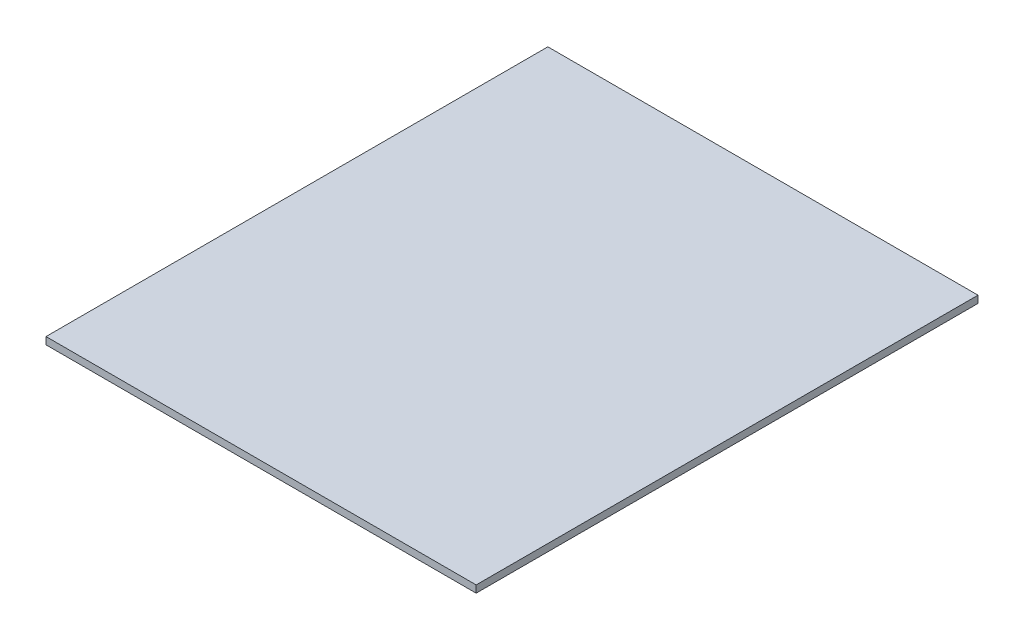
ISO-10303-21;
HEADER;
FILE_DESCRIPTION(('STEP AP214'),'2;1');
FILE_NAME('part.step','',(''),(''),'','','');
FILE_SCHEMA(('AUTOMOTIVE_DESIGN { 1 0 10303 214 1 1 1 1 }'));
ENDSEC;
DATA;
#1=APPLICATION_CONTEXT('core data for automotive mechanical design processes');
#2=APPLICATION_PROTOCOL_DEFINITION('international standard','automotive_design',2000,#1);
#3=PRODUCT_CONTEXT('',#1,'mechanical');
#4=PRODUCT('Part','Part','',(#3));
#5=PRODUCT_RELATED_PRODUCT_CATEGORY('part','',(#4));
#6=PRODUCT_DEFINITION_FORMATION('','',#4);
#7=PRODUCT_DEFINITION_CONTEXT('part definition',#1,'design');
#8=PRODUCT_DEFINITION('design','',#6,#7);
#9=PRODUCT_DEFINITION_SHAPE('','',#8);
#10=(LENGTH_UNIT() NAMED_UNIT(*) SI_UNIT(.MILLI.,.METRE.));
#11=(NAMED_UNIT(*) PLANE_ANGLE_UNIT() SI_UNIT($,.RADIAN.));
#12=(NAMED_UNIT(*) SI_UNIT($,.STERADIAN.) SOLID_ANGLE_UNIT());
#13=UNCERTAINTY_MEASURE_WITH_UNIT(LENGTH_MEASURE(1.E-05),#10,'distance_accuracy_value','');
#14=(GEOMETRIC_REPRESENTATION_CONTEXT(3) GLOBAL_UNCERTAINTY_ASSIGNED_CONTEXT((#13)) GLOBAL_UNIT_ASSIGNED_CONTEXT((#10,
#11,#12)) REPRESENTATION_CONTEXT('',''));
#15=CARTESIAN_POINT('',(0.,0.,0.));
#16=DIRECTION('',(0.,0.,1.));
#17=DIRECTION('',(1.,0.,0.));
#18=AXIS2_PLACEMENT_3D('',#15,#16,#17);
#19=CARTESIAN_POINT('',(1500.,50.,-1750.));
#20=DIRECTION('',(-1.,0.,0.));
#21=DIRECTION('',(0.,0.,1.));
#22=AXIS2_PLACEMENT_3D('',#19,#20,#21);
#23=PLANE('',#22);
#24=DIRECTION('',(0.,0.,-1.));
#25=VECTOR('',#24,1.);
#26=CARTESIAN_POINT('',(1500.,0.,-1750.));
#27=LINE('',#26,#25);
#28=CARTESIAN_POINT('',(1500.,0.,1750.));
#29=VERTEX_POINT('',#28);
#30=CARTESIAN_POINT('',(1500.,0.,-1750.));
#31=VERTEX_POINT('',#30);
#32=EDGE_CURVE('E99',#29,#31,#27,.T.);
#33=ORIENTED_EDGE('',*,*,#32,.T.);
#34=DIRECTION('',(0.,-1.,0.));
#35=VECTOR('',#34,1.);
#36=CARTESIAN_POINT('',(1500.,50.,-1750.));
#37=LINE('',#36,#35);
#38=CARTESIAN_POINT('',(1500.,50.,-1750.));
#39=VERTEX_POINT('',#38);
#40=EDGE_CURVE('E11',#39,#31,#37,.T.);
#41=ORIENTED_EDGE('',*,*,#40,.F.);
#42=DIRECTION('',(0.,0.,-1.));
#43=VECTOR('',#42,1.);
#44=CARTESIAN_POINT('',(1500.,50.,-1750.));
#45=LINE('',#44,#43);
#46=CARTESIAN_POINT('',(1500.,50.,1750.));
#47=VERTEX_POINT('',#46);
#48=EDGE_CURVE('E87',#47,#39,#45,.T.);
#49=ORIENTED_EDGE('',*,*,#48,.F.);
#50=DIRECTION('',(0.,-1.,0.));
#51=VECTOR('',#50,1.);
#52=CARTESIAN_POINT('',(1500.,50.,1750.));
#53=LINE('',#52,#51);
#54=EDGE_CURVE('E95',#47,#29,#53,.T.);
#55=ORIENTED_EDGE('',*,*,#54,.T.);
#56=EDGE_LOOP('',(#33,#41,#49,#55));
#57=FACE_BOUND('',#56,.T.);
#58=ADVANCED_FACE('F36',(#57),#23,.F.);
#59=CARTESIAN_POINT('',(-1500.,50.,-1750.));
#60=DIRECTION('',(0.,0.,1.));
#61=DIRECTION('',(1.,0.,0.));
#62=AXIS2_PLACEMENT_3D('',#59,#60,#61);
#63=PLANE('',#62);
#64=DIRECTION('',(-1.,0.,0.));
#65=VECTOR('',#64,1.);
#66=CARTESIAN_POINT('',(-1500.,0.,-1750.));
#67=LINE('',#66,#65);
#68=CARTESIAN_POINT('',(-1500.,0.,-1750.));
#69=VERTEX_POINT('',#68);
#70=EDGE_CURVE('E91',#31,#69,#67,.T.);
#71=ORIENTED_EDGE('',*,*,#70,.T.);
#72=DIRECTION('',(0.,-1.,0.));
#73=VECTOR('',#72,1.);
#74=CARTESIAN_POINT('',(-1500.,50.,-1750.));
#75=LINE('',#74,#73);
#76=CARTESIAN_POINT('',(-1500.,50.,-1750.));
#77=VERTEX_POINT('',#76);
#78=EDGE_CURVE('E44',#77,#69,#75,.T.);
#79=ORIENTED_EDGE('',*,*,#78,.F.);
#80=DIRECTION('',(-1.,0.,0.));
#81=VECTOR('',#80,1.);
#82=CARTESIAN_POINT('',(-1500.,50.,-1750.));
#83=LINE('',#82,#81);
#84=EDGE_CURVE('E82',#39,#77,#83,.T.);
#85=ORIENTED_EDGE('',*,*,#84,.F.);
#86=ORIENTED_EDGE('',*,*,#40,.T.);
#87=EDGE_LOOP('',(#71,#79,#85,#86));
#88=FACE_BOUND('',#87,.T.);
#89=ADVANCED_FACE('F90',(#88),#63,.F.);
#90=CARTESIAN_POINT('',(-1500.,50.,-1750.));
#91=DIRECTION('',(1.,0.,0.));
#92=DIRECTION('',(0.,0.,-1.));
#93=AXIS2_PLACEMENT_3D('',#90,#91,#92);
#94=PLANE('',#93);
#95=DIRECTION('',(0.,0.,1.));
#96=VECTOR('',#95,1.);
#97=CARTESIAN_POINT('',(-1500.,0.,-1750.));
#98=LINE('',#97,#96);
#99=CARTESIAN_POINT('',(-1500.,0.,1750.));
#100=VERTEX_POINT('',#99);
#101=EDGE_CURVE('E69',#69,#100,#98,.T.);
#102=ORIENTED_EDGE('',*,*,#101,.T.);
#103=DIRECTION('',(0.,-1.,0.));
#104=VECTOR('',#103,1.);
#105=CARTESIAN_POINT('',(-1500.,50.,1750.));
#106=LINE('',#105,#104);
#107=CARTESIAN_POINT('',(-1500.,50.,1750.));
#108=VERTEX_POINT('',#107);
#109=EDGE_CURVE('E92',#108,#100,#106,.T.);
#110=ORIENTED_EDGE('',*,*,#109,.F.);
#111=DIRECTION('',(0.,0.,1.));
#112=VECTOR('',#111,1.);
#113=CARTESIAN_POINT('',(-1500.,50.,-1750.));
#114=LINE('',#113,#112);
#115=EDGE_CURVE('E85',#77,#108,#114,.T.);
#116=ORIENTED_EDGE('',*,*,#115,.F.);
#117=ORIENTED_EDGE('',*,*,#78,.T.);
#118=EDGE_LOOP('',(#102,#110,#116,#117));
#119=FACE_BOUND('',#118,.T.);
#120=ADVANCED_FACE('F93',(#119),#94,.F.);
#121=CARTESIAN_POINT('',(-1500.,50.,1750.));
#122=DIRECTION('',(0.,0.,-1.));
#123=DIRECTION('',(-1.,0.,0.));
#124=AXIS2_PLACEMENT_3D('',#121,#122,#123);
#125=PLANE('',#124);
#126=DIRECTION('',(1.,0.,0.));
#127=VECTOR('',#126,1.);
#128=CARTESIAN_POINT('',(-1500.,0.,1750.));
#129=LINE('',#128,#127);
#130=EDGE_CURVE('E75',#100,#29,#129,.T.);
#131=ORIENTED_EDGE('',*,*,#130,.T.);
#132=ORIENTED_EDGE('',*,*,#54,.F.);
#133=DIRECTION('',(1.,0.,0.));
#134=VECTOR('',#133,1.);
#135=CARTESIAN_POINT('',(-1500.,50.,1750.));
#136=LINE('',#135,#134);
#137=EDGE_CURVE('E52',#108,#47,#136,.T.);
#138=ORIENTED_EDGE('',*,*,#137,.F.);
#139=ORIENTED_EDGE('',*,*,#109,.T.);
#140=EDGE_LOOP('',(#131,#132,#138,#139));
#141=FACE_BOUND('',#140,.T.);
#142=ADVANCED_FACE('F106',(#141),#125,.F.);
#143=CARTESIAN_POINT('',(0.,50.,0.));
#144=DIRECTION('',(0.,1.,0.));
#145=DIRECTION('',(0.,0.,1.));
#146=AXIS2_PLACEMENT_3D('',#143,#144,#145);
#147=PLANE('',#146);
#148=ORIENTED_EDGE('',*,*,#48,.T.);
#149=ORIENTED_EDGE('',*,*,#84,.T.);
#150=ORIENTED_EDGE('',*,*,#115,.T.);
#151=ORIENTED_EDGE('',*,*,#137,.T.);
#152=EDGE_LOOP('',(#148,#149,#150,#151));
#153=FACE_BOUND('',#152,.T.);
#154=ADVANCED_FACE('F83',(#153),#147,.T.);
#155=CARTESIAN_POINT('',(0.,0.,0.));
#156=DIRECTION('',(0.,1.,0.));
#157=DIRECTION('',(0.,0.,1.));
#158=AXIS2_PLACEMENT_3D('',#155,#156,#157);
#159=PLANE('',#158);
#160=ORIENTED_EDGE('',*,*,#32,.F.);
#161=ORIENTED_EDGE('',*,*,#130,.F.);
#162=ORIENTED_EDGE('',*,*,#101,.F.);
#163=ORIENTED_EDGE('',*,*,#70,.F.);
#164=EDGE_LOOP('',(#160,#161,#162,#163));
#165=FACE_BOUND('',#164,.T.);
#166=ADVANCED_FACE('F109',(#165),#159,.F.);
#167=CLOSED_SHELL('',(#58,#89,#120,#142,#154,#166));
#168=MANIFOLD_SOLID_BREP('B2',#167);
#169=ADVANCED_BREP_SHAPE_REPRESENTATION('',(#18,#168),#14);
#170=SHAPE_DEFINITION_REPRESENTATION(#9,#169);
ENDSEC;
END-ISO-10303-21;
